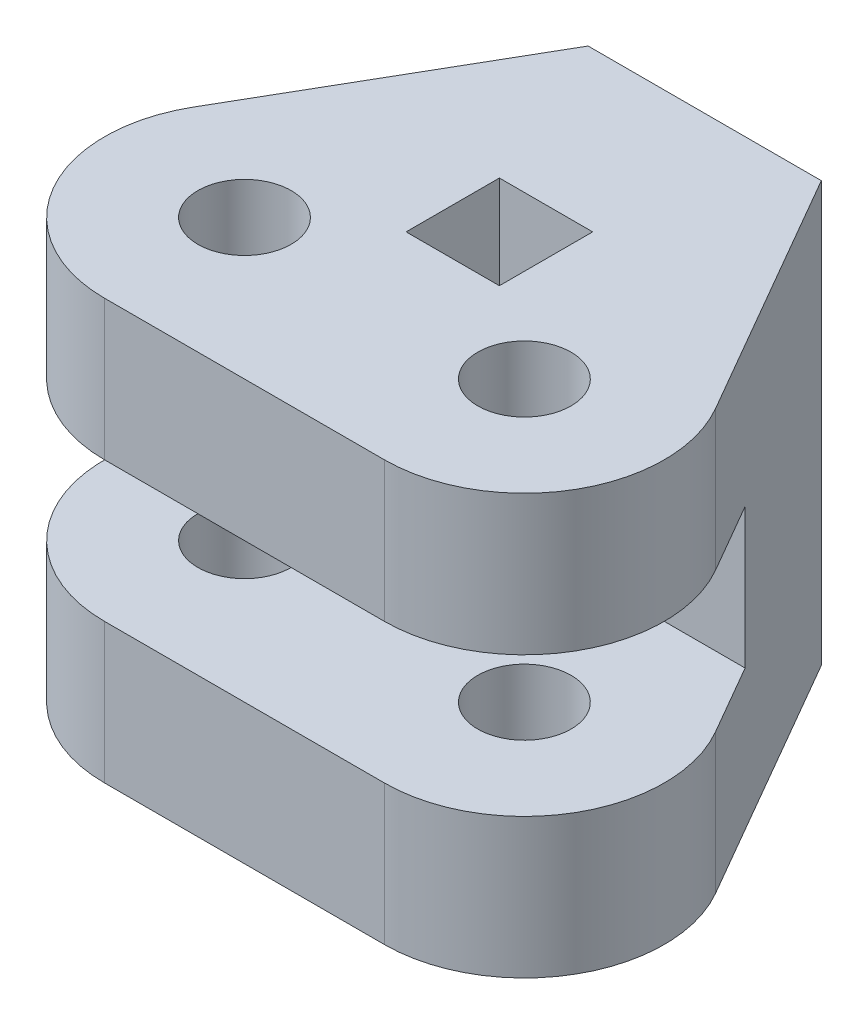
ISO-10303-21;
HEADER;
FILE_DESCRIPTION(('STEP AP214'),'2;1');
FILE_NAME('part.step','',(''),(''),'','','');
FILE_SCHEMA(('AUTOMOTIVE_DESIGN { 1 0 10303 214 1 1 1 1 }'));
ENDSEC;
DATA;
#1=APPLICATION_CONTEXT('core data for automotive mechanical design processes');
#2=APPLICATION_PROTOCOL_DEFINITION('international standard','automotive_design',2000,#1);
#3=PRODUCT_CONTEXT('',#1,'mechanical');
#4=PRODUCT('Part','Part','',(#3));
#5=PRODUCT_RELATED_PRODUCT_CATEGORY('part','',(#4));
#6=PRODUCT_DEFINITION_FORMATION('','',#4);
#7=PRODUCT_DEFINITION_CONTEXT('part definition',#1,'design');
#8=PRODUCT_DEFINITION('design','',#6,#7);
#9=PRODUCT_DEFINITION_SHAPE('','',#8);
#10=(LENGTH_UNIT() NAMED_UNIT(*) SI_UNIT(.MILLI.,.METRE.));
#11=(NAMED_UNIT(*) PLANE_ANGLE_UNIT() SI_UNIT($,.RADIAN.));
#12=(NAMED_UNIT(*) SI_UNIT($,.STERADIAN.) SOLID_ANGLE_UNIT());
#13=UNCERTAINTY_MEASURE_WITH_UNIT(LENGTH_MEASURE(1.E-05),#10,'distance_accuracy_value','');
#14=(GEOMETRIC_REPRESENTATION_CONTEXT(3) GLOBAL_UNCERTAINTY_ASSIGNED_CONTEXT((#13)) GLOBAL_UNIT_ASSIGNED_CONTEXT((#10,
#11,#12)) REPRESENTATION_CONTEXT('',''));
#15=CARTESIAN_POINT('',(0.,0.,0.));
#16=DIRECTION('',(0.,0.,1.));
#17=DIRECTION('',(1.,0.,0.));
#18=AXIS2_PLACEMENT_3D('',#15,#16,#17);
#19=CARTESIAN_POINT('',(3.,9.,5.19615242270663));
#20=DIRECTION('',(0.,-1.,0.));
#21=DIRECTION('',(0.,0.,-1.));
#22=AXIS2_PLACEMENT_3D('',#19,#20,#21);
#23=CYLINDRICAL_SURFACE('',#22,3.);
#24=DIRECTION('',(0.,-1.,0.));
#25=VECTOR('',#24,1.);
#26=CARTESIAN_POINT('',(2.99999999999996,9.,8.19615242270663));
#27=LINE('',#26,#25);
#28=CARTESIAN_POINT('',(2.99999999999996,9.,8.19615242270663));
#29=VERTEX_POINT('',#28);
#30=CARTESIAN_POINT('',(2.99999999999996,6.,8.19615242270663));
#31=VERTEX_POINT('',#30);
#32=EDGE_CURVE('E193',#29,#31,#27,.T.);
#33=ORIENTED_EDGE('',*,*,#32,.T.);
#34=CARTESIAN_POINT('',(3.,6.,5.19615242270663));
#35=DIRECTION('',(0.,1.,0.));
#36=DIRECTION('',(0.,0.,1.));
#37=AXIS2_PLACEMENT_3D('',#34,#35,#36);
#38=CIRCLE('',#37,3.);
#39=CARTESIAN_POINT('',(5.59807621135329,6.,3.69615242270659));
#40=VERTEX_POINT('',#39);
#41=EDGE_CURVE('E245',#31,#40,#38,.T.);
#42=ORIENTED_EDGE('',*,*,#41,.T.);
#43=DIRECTION('',(0.,-1.,0.));
#44=VECTOR('',#43,1.);
#45=CARTESIAN_POINT('',(5.59807621135329,9.,3.69615242270659));
#46=LINE('',#45,#44);
#47=CARTESIAN_POINT('',(5.59807621135329,9.,3.69615242270659));
#48=VERTEX_POINT('',#47);
#49=EDGE_CURVE('E43',#48,#40,#46,.T.);
#50=ORIENTED_EDGE('',*,*,#49,.F.);
#51=CARTESIAN_POINT('',(3.,9.,5.19615242270663));
#52=DIRECTION('',(0.,1.,0.));
#53=DIRECTION('',(0.,0.,-1.));
#54=AXIS2_PLACEMENT_3D('',#51,#52,#53);
#55=CIRCLE('',#54,3.);
#56=EDGE_CURVE('E301',#29,#48,#55,.T.);
#57=ORIENTED_EDGE('',*,*,#56,.F.);
#58=EDGE_LOOP('',(#33,#42,#50,#57));
#59=FACE_BOUND('',#58,.T.);
#60=ADVANCED_FACE('F35',(#59),#23,.T.);
#61=CARTESIAN_POINT('',(-3.,9.,5.19615242270663));
#62=DIRECTION('',(0.,-1.,0.));
#63=DIRECTION('',(0.,0.,-1.));
#64=AXIS2_PLACEMENT_3D('',#61,#62,#63);
#65=CYLINDRICAL_SURFACE('',#64,3.);
#66=DIRECTION('',(0.,-1.,0.));
#67=VECTOR('',#66,1.);
#68=CARTESIAN_POINT('',(-5.59807621135332,9.,3.69615242270663));
#69=LINE('',#68,#67);
#70=CARTESIAN_POINT('',(-5.59807621135332,9.,3.69615242270663));
#71=VERTEX_POINT('',#70);
#72=CARTESIAN_POINT('',(-5.59807621135332,6.,3.69615242270663));
#73=VERTEX_POINT('',#72);
#74=EDGE_CURVE('E207',#71,#73,#69,.T.);
#75=ORIENTED_EDGE('',*,*,#74,.T.);
#76=CARTESIAN_POINT('',(-3.,6.,5.19615242270663));
#77=DIRECTION('',(0.,1.,0.));
#78=DIRECTION('',(0.,0.,1.));
#79=AXIS2_PLACEMENT_3D('',#76,#77,#78);
#80=CIRCLE('',#79,3.);
#81=CARTESIAN_POINT('',(-3.,6.,8.19615242270663));
#82=VERTEX_POINT('',#81);
#83=EDGE_CURVE('E237',#73,#82,#80,.T.);
#84=ORIENTED_EDGE('',*,*,#83,.T.);
#85=DIRECTION('',(0.,-1.,0.));
#86=VECTOR('',#85,1.);
#87=CARTESIAN_POINT('',(-3.,9.,8.19615242270663));
#88=LINE('',#87,#86);
#89=CARTESIAN_POINT('',(-3.,9.,8.19615242270663));
#90=VERTEX_POINT('',#89);
#91=EDGE_CURVE('E203',#90,#82,#88,.T.);
#92=ORIENTED_EDGE('',*,*,#91,.F.);
#93=CARTESIAN_POINT('',(-3.,9.,5.19615242270663));
#94=DIRECTION('',(0.,1.,0.));
#95=DIRECTION('',(0.,0.,1.));
#96=AXIS2_PLACEMENT_3D('',#93,#94,#95);
#97=CIRCLE('',#96,3.);
#98=EDGE_CURVE('E198',#71,#90,#97,.T.);
#99=ORIENTED_EDGE('',*,*,#98,.F.);
#100=EDGE_LOOP('',(#75,#84,#92,#99));
#101=FACE_BOUND('',#100,.T.);
#102=ADVANCED_FACE('F423',(#101),#65,.T.);
#103=CARTESIAN_POINT('',(-3.,9.,8.19615242270663));
#104=DIRECTION('',(0.,0.,-1.));
#105=DIRECTION('',(-1.,0.,0.));
#106=AXIS2_PLACEMENT_3D('',#103,#104,#105);
#107=PLANE('',#106);
#108=ORIENTED_EDGE('',*,*,#91,.T.);
#109=DIRECTION('',(-1.,0.,0.));
#110=VECTOR('',#109,1.);
#111=CARTESIAN_POINT('',(-6.,6.,8.19615242270663));
#112=LINE('',#111,#110);
#113=EDGE_CURVE('E186',#31,#82,#112,.T.);
#114=ORIENTED_EDGE('',*,*,#113,.F.);
#115=ORIENTED_EDGE('',*,*,#32,.F.);
#116=DIRECTION('',(1.,0.,0.));
#117=VECTOR('',#116,1.);
#118=CARTESIAN_POINT('',(-3.,9.,8.19615242270663));
#119=LINE('',#118,#117);
#120=EDGE_CURVE('E194',#90,#29,#119,.T.);
#121=ORIENTED_EDGE('',*,*,#120,.F.);
#122=EDGE_LOOP('',(#108,#114,#115,#121));
#123=FACE_BOUND('',#122,.T.);
#124=ADVANCED_FACE('F421',(#123),#107,.F.);
#125=CARTESIAN_POINT('',(1.,9.,3.73205080756888));
#126=DIRECTION('',(0.,0.,-1.));
#127=DIRECTION('',(-1.,0.,0.));
#128=AXIS2_PLACEMENT_3D('',#125,#126,#127);
#129=PLANE('',#128);
#130=DIRECTION('',(1.,0.,0.));
#131=VECTOR('',#130,1.);
#132=CARTESIAN_POINT('',(1.,6.,3.73205080756888));
#133=LINE('',#132,#131);
#134=CARTESIAN_POINT('',(-1.,6.,3.73205080756888));
#135=VERTEX_POINT('',#134);
#136=CARTESIAN_POINT('',(1.,6.,3.73205080756888));
#137=VERTEX_POINT('',#136);
#138=EDGE_CURVE('E230',#135,#137,#133,.T.);
#139=ORIENTED_EDGE('',*,*,#138,.F.);
#140=DIRECTION('',(0.,-1.,0.));
#141=VECTOR('',#140,1.);
#142=CARTESIAN_POINT('',(-1.,9.,3.73205080756888));
#143=LINE('',#142,#141);
#144=CARTESIAN_POINT('',(-1.,9.,3.73205080756888));
#145=VERTEX_POINT('',#144);
#146=EDGE_CURVE('E297',#145,#135,#143,.T.);
#147=ORIENTED_EDGE('',*,*,#146,.F.);
#148=DIRECTION('',(1.,0.,0.));
#149=VECTOR('',#148,1.);
#150=CARTESIAN_POINT('',(1.,9.,3.73205080756888));
#151=LINE('',#150,#149);
#152=CARTESIAN_POINT('',(1.,9.,3.73205080756888));
#153=VERTEX_POINT('',#152);
#154=EDGE_CURVE('E269',#145,#153,#151,.T.);
#155=ORIENTED_EDGE('',*,*,#154,.T.);
#156=DIRECTION('',(0.,-1.,0.));
#157=VECTOR('',#156,1.);
#158=CARTESIAN_POINT('',(1.,9.,3.73205080756888));
#159=LINE('',#158,#157);
#160=EDGE_CURVE('E293',#153,#137,#159,.T.);
#161=ORIENTED_EDGE('',*,*,#160,.T.);
#162=EDGE_LOOP('',(#139,#147,#155,#161));
#163=FACE_BOUND('',#162,.T.);
#164=ADVANCED_FACE('F391',(#163),#129,.T.);
#165=CARTESIAN_POINT('',(-3.,9.,5.19615242270663));
#166=DIRECTION('',(0.,-1.,0.));
#167=DIRECTION('',(0.,0.,-1.));
#168=AXIS2_PLACEMENT_3D('',#165,#166,#167);
#169=CYLINDRICAL_SURFACE('',#168,1.);
#170=CARTESIAN_POINT('',(-3.,6.,5.19615242270663));
#171=DIRECTION('',(0.,1.,0.));
#172=DIRECTION('',(0.,0.,1.));
#173=AXIS2_PLACEMENT_3D('',#170,#171,#172);
#174=CIRCLE('',#173,1.);
#175=CARTESIAN_POINT('',(-3.,6.,6.19615242270664));
#176=VERTEX_POINT('',#175);
#177=EDGE_CURVE('E222',#176,#176,#174,.T.);
#178=ORIENTED_EDGE('',*,*,#177,.F.);
#179=EDGE_LOOP('',(#178));
#180=FACE_BOUND('',#179,.T.);
#181=CARTESIAN_POINT('',(-3.,9.,5.19615242270663));
#182=DIRECTION('',(0.,1.,0.));
#183=DIRECTION('',(0.,0.,1.));
#184=AXIS2_PLACEMENT_3D('',#181,#182,#183);
#185=CIRCLE('',#184,1.);
#186=CARTESIAN_POINT('',(-3.,9.,6.19615242270664));
#187=VERTEX_POINT('',#186);
#188=EDGE_CURVE('E261',#187,#187,#185,.T.);
#189=ORIENTED_EDGE('',*,*,#188,.T.);
#190=EDGE_LOOP('',(#189));
#191=FACE_BOUND('',#190,.T.);
#192=ADVANCED_FACE('F420',(#180,#191),#169,.F.);
#193=CARTESIAN_POINT('',(3.,9.,5.19615242270663));
#194=DIRECTION('',(0.,-1.,0.));
#195=DIRECTION('',(0.,0.,-1.));
#196=AXIS2_PLACEMENT_3D('',#193,#194,#195);
#197=CYLINDRICAL_SURFACE('',#196,1.);
#198=CARTESIAN_POINT('',(3.,6.,5.19615242270663));
#199=DIRECTION('',(0.,1.,0.));
#200=DIRECTION('',(0.,0.,1.));
#201=AXIS2_PLACEMENT_3D('',#198,#199,#200);
#202=CIRCLE('',#201,1.);
#203=CARTESIAN_POINT('',(3.,6.,6.19615242270663));
#204=VERTEX_POINT('',#203);
#205=EDGE_CURVE('E179',#204,#204,#202,.T.);
#206=ORIENTED_EDGE('',*,*,#205,.F.);
#207=EDGE_LOOP('',(#206));
#208=FACE_BOUND('',#207,.T.);
#209=CARTESIAN_POINT('',(3.,9.,5.19615242270663));
#210=DIRECTION('',(0.,1.,0.));
#211=DIRECTION('',(0.,0.,1.));
#212=AXIS2_PLACEMENT_3D('',#209,#210,#211);
#213=CIRCLE('',#212,1.);
#214=CARTESIAN_POINT('',(3.,9.,6.19615242270663));
#215=VERTEX_POINT('',#214);
#216=EDGE_CURVE('E255',#215,#215,#213,.T.);
#217=ORIENTED_EDGE('',*,*,#216,.T.);
#218=EDGE_LOOP('',(#217));
#219=FACE_BOUND('',#218,.T.);
#220=ADVANCED_FACE('F439',(#208,#219),#197,.F.);
#221=CARTESIAN_POINT('',(3.,9.,5.19615242270663));
#222=DIRECTION('',(0.,-1.,0.));
#223=DIRECTION('',(0.,0.,-1.));
#224=AXIS2_PLACEMENT_3D('',#221,#222,#223);
#225=PLANE('',#224);
#226=ORIENTED_EDGE('',*,*,#188,.F.);
#227=EDGE_LOOP('',(#226));
#228=FACE_BOUND('',#227,.T.);
#229=ORIENTED_EDGE('',*,*,#56,.T.);
#230=DIRECTION('',(-0.5,0.,-0.866025403784439));
#231=VECTOR('',#230,1.);
#232=CARTESIAN_POINT('',(5.59807621135329,9.,3.69615242270659));
#233=LINE('',#232,#231);
#234=CARTESIAN_POINT('',(2.5,9.,-1.66987298107781));
#235=VERTEX_POINT('',#234);
#236=EDGE_CURVE('E304',#48,#235,#233,.T.);
#237=ORIENTED_EDGE('',*,*,#236,.T.);
#238=DIRECTION('',(-1.,0.,0.));
#239=VECTOR('',#238,1.);
#240=CARTESIAN_POINT('',(-2.5,9.,-1.66987298107781));
#241=LINE('',#240,#239);
#242=CARTESIAN_POINT('',(-2.5,9.,-1.66987298107781));
#243=VERTEX_POINT('',#242);
#244=EDGE_CURVE('E306',#235,#243,#241,.T.);
#245=ORIENTED_EDGE('',*,*,#244,.T.);
#246=DIRECTION('',(-0.5,0.,0.866025403784439));
#247=VECTOR('',#246,1.);
#248=CARTESIAN_POINT('',(-2.5,9.,-1.66987298107781));
#249=LINE('',#248,#247);
#250=EDGE_CURVE('E308',#243,#71,#249,.T.);
#251=ORIENTED_EDGE('',*,*,#250,.T.);
#252=ORIENTED_EDGE('',*,*,#98,.T.);
#253=ORIENTED_EDGE('',*,*,#120,.T.);
#254=EDGE_LOOP('',(#229,#237,#245,#251,#252,#253));
#255=FACE_BOUND('',#254,.T.);
#256=DIRECTION('',(0.,0.,1.));
#257=VECTOR('',#256,1.);
#258=CARTESIAN_POINT('',(-1.,9.,3.73205080756888));
#259=LINE('',#258,#257);
#260=CARTESIAN_POINT('',(-1.,9.,1.73205080756888));
#261=VERTEX_POINT('',#260);
#262=EDGE_CURVE('E267',#261,#145,#259,.T.);
#263=ORIENTED_EDGE('',*,*,#262,.F.);
#264=DIRECTION('',(-1.,0.,0.));
#265=VECTOR('',#264,1.);
#266=CARTESIAN_POINT('',(-1.,9.,1.73205080756888));
#267=LINE('',#266,#265);
#268=CARTESIAN_POINT('',(1.,9.,1.73205080756888));
#269=VERTEX_POINT('',#268);
#270=EDGE_CURVE('E275',#269,#261,#267,.T.);
#271=ORIENTED_EDGE('',*,*,#270,.F.);
#272=DIRECTION('',(0.,0.,-1.));
#273=VECTOR('',#272,1.);
#274=CARTESIAN_POINT('',(1.,9.,1.73205080756888));
#275=LINE('',#274,#273);
#276=EDGE_CURVE('E272',#153,#269,#275,.T.);
#277=ORIENTED_EDGE('',*,*,#276,.F.);
#278=ORIENTED_EDGE('',*,*,#154,.F.);
#279=EDGE_LOOP('',(#263,#271,#277,#278));
#280=FACE_BOUND('',#279,.T.);
#281=ORIENTED_EDGE('',*,*,#216,.F.);
#282=EDGE_LOOP('',(#281));
#283=FACE_BOUND('',#282,.T.);
#284=ADVANCED_FACE('F339',(#228,#255,#280,#283),#225,.F.);
#285=CARTESIAN_POINT('',(3.,0.,5.19615242270663));
#286=DIRECTION('',(0.,-1.,0.));
#287=DIRECTION('',(0.,0.,-1.));
#288=AXIS2_PLACEMENT_3D('',#285,#286,#287);
#289=PLANE('',#288);
#290=CARTESIAN_POINT('',(-3.,0.,5.19615242270663));
#291=DIRECTION('',(0.,1.,0.));
#292=DIRECTION('',(0.,0.,1.));
#293=AXIS2_PLACEMENT_3D('',#290,#291,#292);
#294=CIRCLE('',#293,1.);
#295=CARTESIAN_POINT('',(-3.,0.,6.19615242270664));
#296=VERTEX_POINT('',#295);
#297=EDGE_CURVE('E258',#296,#296,#294,.T.);
#298=ORIENTED_EDGE('',*,*,#297,.T.);
#299=EDGE_LOOP('',(#298));
#300=FACE_BOUND('',#299,.T.);
#301=CARTESIAN_POINT('',(3.,0.,5.19615242270663));
#302=DIRECTION('',(0.,1.,0.));
#303=DIRECTION('',(0.,0.,-1.));
#304=AXIS2_PLACEMENT_3D('',#301,#302,#303);
#305=CIRCLE('',#304,3.);
#306=CARTESIAN_POINT('',(2.99999999999996,0.,8.19615242270663));
#307=VERTEX_POINT('',#306);
#308=CARTESIAN_POINT('',(5.59807621135329,0.,3.69615242270659));
#309=VERTEX_POINT('',#308);
#310=EDGE_CURVE('E300',#307,#309,#305,.T.);
#311=ORIENTED_EDGE('',*,*,#310,.F.);
#312=DIRECTION('',(1.,0.,0.));
#313=VECTOR('',#312,1.);
#314=CARTESIAN_POINT('',(-3.,0.,8.19615242270663));
#315=LINE('',#314,#313);
#316=CARTESIAN_POINT('',(-3.,0.,8.19615242270663));
#317=VERTEX_POINT('',#316);
#318=EDGE_CURVE('E191',#317,#307,#315,.T.);
#319=ORIENTED_EDGE('',*,*,#318,.F.);
#320=CARTESIAN_POINT('',(-3.,0.,5.19615242270663));
#321=DIRECTION('',(0.,1.,0.));
#322=DIRECTION('',(0.,0.,1.));
#323=AXIS2_PLACEMENT_3D('',#320,#321,#322);
#324=CIRCLE('',#323,3.);
#325=CARTESIAN_POINT('',(-5.59807621135332,0.,3.69615242270663));
#326=VERTEX_POINT('',#325);
#327=EDGE_CURVE('E318',#326,#317,#324,.T.);
#328=ORIENTED_EDGE('',*,*,#327,.F.);
#329=DIRECTION('',(-0.5,0.,0.866025403784439));
#330=VECTOR('',#329,1.);
#331=CARTESIAN_POINT('',(-2.5,0.,-1.66987298107781));
#332=LINE('',#331,#330);
#333=CARTESIAN_POINT('',(-2.5,0.,-1.66987298107781));
#334=VERTEX_POINT('',#333);
#335=EDGE_CURVE('E316',#334,#326,#332,.T.);
#336=ORIENTED_EDGE('',*,*,#335,.F.);
#337=DIRECTION('',(-1.,0.,0.));
#338=VECTOR('',#337,1.);
#339=CARTESIAN_POINT('',(-2.5,0.,-1.66987298107781));
#340=LINE('',#339,#338);
#341=CARTESIAN_POINT('',(2.5,0.,-1.66987298107781));
#342=VERTEX_POINT('',#341);
#343=EDGE_CURVE('E314',#342,#334,#340,.T.);
#344=ORIENTED_EDGE('',*,*,#343,.F.);
#345=DIRECTION('',(-0.5,0.,-0.866025403784439));
#346=VECTOR('',#345,1.);
#347=CARTESIAN_POINT('',(5.59807621135329,0.,3.69615242270659));
#348=LINE('',#347,#346);
#349=EDGE_CURVE('E312',#309,#342,#348,.T.);
#350=ORIENTED_EDGE('',*,*,#349,.F.);
#351=EDGE_LOOP('',(#311,#319,#328,#336,#344,#350));
#352=FACE_BOUND('',#351,.T.);
#353=DIRECTION('',(-1.,0.,0.));
#354=VECTOR('',#353,1.);
#355=CARTESIAN_POINT('',(-1.,0.,1.73205080756888));
#356=LINE('',#355,#354);
#357=CARTESIAN_POINT('',(1.,0.,1.73205080756888));
#358=VERTEX_POINT('',#357);
#359=CARTESIAN_POINT('',(-1.,0.,1.73205080756888));
#360=VERTEX_POINT('',#359);
#361=EDGE_CURVE('E270',#358,#360,#356,.T.);
#362=ORIENTED_EDGE('',*,*,#361,.T.);
#363=DIRECTION('',(0.,0.,1.));
#364=VECTOR('',#363,1.);
#365=CARTESIAN_POINT('',(-1.,0.,3.73205080756888));
#366=LINE('',#365,#364);
#367=CARTESIAN_POINT('',(-1.,0.,3.73205080756888));
#368=VERTEX_POINT('',#367);
#369=EDGE_CURVE('E264',#360,#368,#366,.T.);
#370=ORIENTED_EDGE('',*,*,#369,.T.);
#371=DIRECTION('',(1.,0.,0.));
#372=VECTOR('',#371,1.);
#373=CARTESIAN_POINT('',(1.,0.,3.73205080756888));
#374=LINE('',#373,#372);
#375=CARTESIAN_POINT('',(1.,0.,3.73205080756888));
#376=VERTEX_POINT('',#375);
#377=EDGE_CURVE('E280',#368,#376,#374,.T.);
#378=ORIENTED_EDGE('',*,*,#377,.T.);
#379=DIRECTION('',(0.,0.,-1.));
#380=VECTOR('',#379,1.);
#381=CARTESIAN_POINT('',(1.,0.,1.73205080756888));
#382=LINE('',#381,#380);
#383=EDGE_CURVE('E283',#376,#358,#382,.T.);
#384=ORIENTED_EDGE('',*,*,#383,.T.);
#385=EDGE_LOOP('',(#362,#370,#378,#384));
#386=FACE_BOUND('',#385,.T.);
#387=CARTESIAN_POINT('',(3.,0.,5.19615242270663));
#388=DIRECTION('',(0.,1.,0.));
#389=DIRECTION('',(0.,0.,1.));
#390=AXIS2_PLACEMENT_3D('',#387,#388,#389);
#391=CIRCLE('',#390,1.);
#392=CARTESIAN_POINT('',(3.,0.,6.19615242270663));
#393=VERTEX_POINT('',#392);
#394=EDGE_CURVE('E254',#393,#393,#391,.T.);
#395=ORIENTED_EDGE('',*,*,#394,.T.);
#396=EDGE_LOOP('',(#395));
#397=FACE_BOUND('',#396,.T.);
#398=ADVANCED_FACE('F326',(#300,#352,#386,#397),#289,.T.);
#399=CARTESIAN_POINT('',(5.59807621135329,3.,3.69615242270659));
#400=VERTEX_POINT('',#399);
#401=EDGE_CURVE('E177',#400,#309,#46,.T.);
#402=ORIENTED_EDGE('',*,*,#401,.F.);
#403=CARTESIAN_POINT('',(3.,3.,5.19615242270663));
#404=DIRECTION('',(0.,-1.,0.));
#405=DIRECTION('',(0.,0.,-1.));
#406=AXIS2_PLACEMENT_3D('',#403,#404,#405);
#407=CIRCLE('',#406,3.);
#408=CARTESIAN_POINT('',(2.99999999999996,3.,8.19615242270663));
#409=VERTEX_POINT('',#408);
#410=EDGE_CURVE('E172',#400,#409,#407,.T.);
#411=ORIENTED_EDGE('',*,*,#410,.T.);
#412=EDGE_CURVE('E175',#409,#307,#27,.T.);
#413=ORIENTED_EDGE('',*,*,#412,.T.);
#414=ORIENTED_EDGE('',*,*,#310,.T.);
#415=EDGE_LOOP('',(#402,#411,#413,#414));
#416=FACE_BOUND('',#415,.T.);
#417=ADVANCED_FACE('F37',(#416),#23,.T.);
#418=CARTESIAN_POINT('',(5.59807621135329,9.,3.69615242270659));
#419=DIRECTION('',(-0.866025403784439,0.,0.5));
#420=DIRECTION('',(0.5,0.,0.866025403784439));
#421=AXIS2_PLACEMENT_3D('',#418,#419,#420);
#422=PLANE('',#421);
#423=ORIENTED_EDGE('',*,*,#49,.T.);
#424=DIRECTION('',(-0.5,0.,-0.866025403784439));
#425=VECTOR('',#424,1.);
#426=CARTESIAN_POINT('',(5.59807621135329,6.,3.69615242270659));
#427=LINE('',#426,#425);
#428=CARTESIAN_POINT('',(4.73205080756888,6.,2.19615242270663));
#429=VERTEX_POINT('',#428);
#430=EDGE_CURVE('E242',#40,#429,#427,.T.);
#431=ORIENTED_EDGE('',*,*,#430,.T.);
#432=DIRECTION('',(0.,1.,0.));
#433=VECTOR('',#432,1.);
#434=CARTESIAN_POINT('',(4.73205080756888,9.,2.19615242270663));
#435=LINE('',#434,#433);
#436=CARTESIAN_POINT('',(4.73205080756888,3.,2.19615242270663));
#437=VERTEX_POINT('',#436);
#438=EDGE_CURVE('E252',#437,#429,#435,.T.);
#439=ORIENTED_EDGE('',*,*,#438,.F.);
#440=DIRECTION('',(0.5,0.,0.866025403784439));
#441=VECTOR('',#440,1.);
#442=CARTESIAN_POINT('',(5.59807621135329,3.,3.69615242270659));
#443=LINE('',#442,#441);
#444=EDGE_CURVE('E180',#437,#400,#443,.T.);
#445=ORIENTED_EDGE('',*,*,#444,.T.);
#446=ORIENTED_EDGE('',*,*,#401,.T.);
#447=ORIENTED_EDGE('',*,*,#349,.T.);
#448=DIRECTION('',(0.,-1.,0.));
#449=VECTOR('',#448,1.);
#450=CARTESIAN_POINT('',(2.5,9.,-1.66987298107781));
#451=LINE('',#450,#449);
#452=EDGE_CURVE('E213',#235,#342,#451,.T.);
#453=ORIENTED_EDGE('',*,*,#452,.F.);
#454=ORIENTED_EDGE('',*,*,#236,.F.);
#455=EDGE_LOOP('',(#423,#431,#439,#445,#446,#447,#453,#454));
#456=FACE_BOUND('',#455,.T.);
#457=ADVANCED_FACE('F332',(#456),#422,.F.);
#458=CARTESIAN_POINT('',(-2.5,9.,-1.66987298107781));
#459=DIRECTION('',(0.,0.,1.));
#460=DIRECTION('',(1.,0.,0.));
#461=AXIS2_PLACEMENT_3D('',#458,#459,#460);
#462=PLANE('',#461);
#463=CARTESIAN_POINT('',(0.,4.5,-1.66987298107781));
#464=DIRECTION('',(0.,0.,-1.));
#465=DIRECTION('',(-1.,0.,0.));
#466=AXIS2_PLACEMENT_3D('',#463,#464,#465);
#467=CIRCLE('',#466,0.5);
#468=CARTESIAN_POINT('',(-0.500000000000001,4.5,-1.66987298107781));
#469=VERTEX_POINT('',#468);
#470=EDGE_CURVE('E187',#469,#469,#467,.T.);
#471=ORIENTED_EDGE('',*,*,#470,.F.);
#472=EDGE_LOOP('',(#471));
#473=FACE_BOUND('',#472,.T.);
#474=ORIENTED_EDGE('',*,*,#343,.T.);
#475=DIRECTION('',(0.,-1.,0.));
#476=VECTOR('',#475,1.);
#477=CARTESIAN_POINT('',(-2.5,9.,-1.66987298107781));
#478=LINE('',#477,#476);
#479=EDGE_CURVE('E210',#243,#334,#478,.T.);
#480=ORIENTED_EDGE('',*,*,#479,.F.);
#481=ORIENTED_EDGE('',*,*,#244,.F.);
#482=ORIENTED_EDGE('',*,*,#452,.T.);
#483=EDGE_LOOP('',(#474,#480,#481,#482));
#484=FACE_BOUND('',#483,.T.);
#485=ADVANCED_FACE('F335',(#473,#484),#462,.F.);
#486=CARTESIAN_POINT('',(-2.5,9.,-1.66987298107781));
#487=DIRECTION('',(0.866025403784439,0.,0.5));
#488=DIRECTION('',(0.5,0.,-0.866025403784439));
#489=AXIS2_PLACEMENT_3D('',#486,#487,#488);
#490=PLANE('',#489);
#491=DIRECTION('',(0.,-1.,0.));
#492=VECTOR('',#491,1.);
#493=CARTESIAN_POINT('',(-4.73205080756888,9.,2.19615242270663));
#494=LINE('',#493,#492);
#495=CARTESIAN_POINT('',(-4.73205080756888,6.,2.19615242270663));
#496=VERTEX_POINT('',#495);
#497=CARTESIAN_POINT('',(-4.73205080756888,3.,2.19615242270663));
#498=VERTEX_POINT('',#497);
#499=EDGE_CURVE('E250',#496,#498,#494,.T.);
#500=ORIENTED_EDGE('',*,*,#499,.F.);
#501=DIRECTION('',(-0.5,0.,0.866025403784439));
#502=VECTOR('',#501,1.);
#503=CARTESIAN_POINT('',(-2.5,6.,-1.66987298107781));
#504=LINE('',#503,#502);
#505=EDGE_CURVE('E239',#496,#73,#504,.T.);
#506=ORIENTED_EDGE('',*,*,#505,.T.);
#507=ORIENTED_EDGE('',*,*,#74,.F.);
#508=ORIENTED_EDGE('',*,*,#250,.F.);
#509=ORIENTED_EDGE('',*,*,#479,.T.);
#510=ORIENTED_EDGE('',*,*,#335,.T.);
#511=CARTESIAN_POINT('',(-5.59807621135332,3.,3.69615242270663));
#512=VERTEX_POINT('',#511);
#513=EDGE_CURVE('E206',#512,#326,#69,.T.);
#514=ORIENTED_EDGE('',*,*,#513,.F.);
#515=DIRECTION('',(0.5,0.,-0.866025403784439));
#516=VECTOR('',#515,1.);
#517=CARTESIAN_POINT('',(-2.5,3.,-1.66987298107781));
#518=LINE('',#517,#516);
#519=EDGE_CURVE('E371',#512,#498,#518,.T.);
#520=ORIENTED_EDGE('',*,*,#519,.T.);
#521=EDGE_LOOP('',(#500,#506,#507,#508,#509,#510,#514,#520));
#522=FACE_BOUND('',#521,.T.);
#523=ADVANCED_FACE('F446',(#522),#490,.F.);
#524=CARTESIAN_POINT('',(-3.,3.,8.19615242270663));
#525=VERTEX_POINT('',#524);
#526=EDGE_CURVE('E197',#525,#317,#88,.T.);
#527=ORIENTED_EDGE('',*,*,#526,.F.);
#528=CARTESIAN_POINT('',(-3.,3.,5.19615242270663));
#529=DIRECTION('',(0.,-1.,0.));
#530=DIRECTION('',(0.,0.,-1.));
#531=AXIS2_PLACEMENT_3D('',#528,#529,#530);
#532=CIRCLE('',#531,3.);
#533=EDGE_CURVE('E50',#525,#512,#532,.T.);
#534=ORIENTED_EDGE('',*,*,#533,.T.);
#535=ORIENTED_EDGE('',*,*,#513,.T.);
#536=ORIENTED_EDGE('',*,*,#327,.T.);
#537=EDGE_LOOP('',(#527,#534,#535,#536));
#538=FACE_BOUND('',#537,.T.);
#539=ADVANCED_FACE('F322',(#538),#65,.T.);
#540=ORIENTED_EDGE('',*,*,#412,.F.);
#541=DIRECTION('',(1.,0.,0.));
#542=VECTOR('',#541,1.);
#543=CARTESIAN_POINT('',(-6.,3.,8.19615242270663));
#544=LINE('',#543,#542);
#545=EDGE_CURVE('E182',#525,#409,#544,.T.);
#546=ORIENTED_EDGE('',*,*,#545,.F.);
#547=ORIENTED_EDGE('',*,*,#526,.T.);
#548=ORIENTED_EDGE('',*,*,#318,.T.);
#549=EDGE_LOOP('',(#540,#546,#547,#548));
#550=FACE_BOUND('',#549,.T.);
#551=ADVANCED_FACE('F189',(#550),#107,.F.);
#552=CARTESIAN_POINT('',(-1.,9.,3.73205080756888));
#553=DIRECTION('',(1.,0.,0.));
#554=DIRECTION('',(0.,0.,-1.));
#555=AXIS2_PLACEMENT_3D('',#552,#553,#554);
#556=PLANE('',#555);
#557=DIRECTION('',(0.,0.,1.));
#558=VECTOR('',#557,1.);
#559=CARTESIAN_POINT('',(-1.,6.,3.73205080756888));
#560=LINE('',#559,#558);
#561=CARTESIAN_POINT('',(-1.,6.,2.19615242270663));
#562=VERTEX_POINT('',#561);
#563=EDGE_CURVE('E235',#562,#135,#560,.T.);
#564=ORIENTED_EDGE('',*,*,#563,.F.);
#565=DIRECTION('',(0.,-1.,0.));
#566=VECTOR('',#565,1.);
#567=CARTESIAN_POINT('',(-1.,9.,2.19615242270663));
#568=LINE('',#567,#566);
#569=CARTESIAN_POINT('',(-1.,3.,2.19615242270663));
#570=VERTEX_POINT('',#569);
#571=EDGE_CURVE('E247',#562,#570,#568,.T.);
#572=ORIENTED_EDGE('',*,*,#571,.T.);
#573=DIRECTION('',(0.,0.,-1.));
#574=VECTOR('',#573,1.);
#575=CARTESIAN_POINT('',(-1.,3.,3.73205080756888));
#576=LINE('',#575,#574);
#577=CARTESIAN_POINT('',(-1.,3.,3.73205080756888));
#578=VERTEX_POINT('',#577);
#579=EDGE_CURVE('E368',#578,#570,#576,.T.);
#580=ORIENTED_EDGE('',*,*,#579,.F.);
#581=EDGE_CURVE('E296',#578,#368,#143,.T.);
#582=ORIENTED_EDGE('',*,*,#581,.T.);
#583=ORIENTED_EDGE('',*,*,#369,.F.);
#584=DIRECTION('',(0.,-1.,0.));
#585=VECTOR('',#584,1.);
#586=CARTESIAN_POINT('',(-1.,9.,1.73205080756888));
#587=LINE('',#586,#585);
#588=EDGE_CURVE('E277',#261,#360,#587,.T.);
#589=ORIENTED_EDGE('',*,*,#588,.F.);
#590=ORIENTED_EDGE('',*,*,#262,.T.);
#591=ORIENTED_EDGE('',*,*,#146,.T.);
#592=EDGE_LOOP('',(#564,#572,#580,#582,#583,#589,#590,#591));
#593=FACE_BOUND('',#592,.T.);
#594=ADVANCED_FACE('F386',(#593),#556,.T.);
#595=DIRECTION('',(-1.,0.,0.));
#596=VECTOR('',#595,1.);
#597=CARTESIAN_POINT('',(1.,3.,3.73205080756888));
#598=LINE('',#597,#596);
#599=CARTESIAN_POINT('',(1.,3.,3.73205080756888));
#600=VERTEX_POINT('',#599);
#601=EDGE_CURVE('E366',#600,#578,#598,.T.);
#602=ORIENTED_EDGE('',*,*,#601,.F.);
#603=EDGE_CURVE('E292',#600,#376,#159,.T.);
#604=ORIENTED_EDGE('',*,*,#603,.T.);
#605=ORIENTED_EDGE('',*,*,#377,.F.);
#606=ORIENTED_EDGE('',*,*,#581,.F.);
#607=EDGE_LOOP('',(#602,#604,#605,#606));
#608=FACE_BOUND('',#607,.T.);
#609=ADVANCED_FACE('F410',(#608),#129,.T.);
#610=CARTESIAN_POINT('',(1.,9.,1.73205080756888));
#611=DIRECTION('',(-1.,0.,0.));
#612=DIRECTION('',(0.,0.,1.));
#613=AXIS2_PLACEMENT_3D('',#610,#611,#612);
#614=PLANE('',#613);
#615=DIRECTION('',(0.,0.,-1.));
#616=VECTOR('',#615,1.);
#617=CARTESIAN_POINT('',(1.,6.,1.73205080756888));
#618=LINE('',#617,#616);
#619=CARTESIAN_POINT('',(1.,6.,2.19615242270663));
#620=VERTEX_POINT('',#619);
#621=EDGE_CURVE('E226',#137,#620,#618,.T.);
#622=ORIENTED_EDGE('',*,*,#621,.F.);
#623=ORIENTED_EDGE('',*,*,#160,.F.);
#624=ORIENTED_EDGE('',*,*,#276,.T.);
#625=DIRECTION('',(0.,-1.,0.));
#626=VECTOR('',#625,1.);
#627=CARTESIAN_POINT('',(1.,9.,1.73205080756888));
#628=LINE('',#627,#626);
#629=EDGE_CURVE('E290',#269,#358,#628,.T.);
#630=ORIENTED_EDGE('',*,*,#629,.T.);
#631=ORIENTED_EDGE('',*,*,#383,.F.);
#632=ORIENTED_EDGE('',*,*,#603,.F.);
#633=DIRECTION('',(0.,0.,1.));
#634=VECTOR('',#633,1.);
#635=CARTESIAN_POINT('',(1.,3.,1.73205080756888));
#636=LINE('',#635,#634);
#637=CARTESIAN_POINT('',(1.,3.,2.19615242270663));
#638=VERTEX_POINT('',#637);
#639=EDGE_CURVE('E364',#638,#600,#636,.T.);
#640=ORIENTED_EDGE('',*,*,#639,.F.);
#641=DIRECTION('',(0.,1.,0.));
#642=VECTOR('',#641,1.);
#643=CARTESIAN_POINT('',(1.,9.,2.19615242270663));
#644=LINE('',#643,#642);
#645=EDGE_CURVE('E11',#638,#620,#644,.T.);
#646=ORIENTED_EDGE('',*,*,#645,.T.);
#647=EDGE_LOOP('',(#622,#623,#624,#630,#631,#632,#640,#646));
#648=FACE_BOUND('',#647,.T.);
#649=ADVANCED_FACE('F396',(#648),#614,.T.);
#650=CARTESIAN_POINT('',(-1.,9.,1.73205080756888));
#651=DIRECTION('',(0.,0.,1.));
#652=DIRECTION('',(1.,0.,0.));
#653=AXIS2_PLACEMENT_3D('',#650,#651,#652);
#654=PLANE('',#653);
#655=CARTESIAN_POINT('',(0.,4.5,1.73205080756888));
#656=DIRECTION('',(0.,0.,1.));
#657=DIRECTION('',(1.,0.,0.));
#658=AXIS2_PLACEMENT_3D('',#655,#656,#657);
#659=CIRCLE('',#658,0.5);
#660=CARTESIAN_POINT('',(0.5,4.5,1.73205080756888));
#661=VERTEX_POINT('',#660);
#662=EDGE_CURVE('E457',#661,#661,#659,.F.);
#663=ORIENTED_EDGE('',*,*,#662,.T.);
#664=EDGE_LOOP('',(#663));
#665=FACE_BOUND('',#664,.T.);
#666=ORIENTED_EDGE('',*,*,#361,.F.);
#667=ORIENTED_EDGE('',*,*,#629,.F.);
#668=ORIENTED_EDGE('',*,*,#270,.T.);
#669=ORIENTED_EDGE('',*,*,#588,.T.);
#670=EDGE_LOOP('',(#666,#667,#668,#669));
#671=FACE_BOUND('',#670,.T.);
#672=ADVANCED_FACE('F403',(#665,#671),#654,.T.);
#673=CARTESIAN_POINT('',(-3.,3.,5.19615242270663));
#674=DIRECTION('',(0.,-1.,0.));
#675=DIRECTION('',(0.,0.,-1.));
#676=AXIS2_PLACEMENT_3D('',#673,#674,#675);
#677=CIRCLE('',#676,1.);
#678=CARTESIAN_POINT('',(-3.,3.,4.19615242270663));
#679=VERTEX_POINT('',#678);
#680=EDGE_CURVE('E220',#679,#679,#677,.T.);
#681=ORIENTED_EDGE('',*,*,#680,.F.);
#682=EDGE_LOOP('',(#681));
#683=FACE_BOUND('',#682,.T.);
#684=ORIENTED_EDGE('',*,*,#297,.F.);
#685=EDGE_LOOP('',(#684));
#686=FACE_BOUND('',#685,.T.);
#687=ADVANCED_FACE('F479',(#683,#686),#169,.F.);
#688=CARTESIAN_POINT('',(3.,3.,5.19615242270663));
#689=DIRECTION('',(0.,-1.,0.));
#690=DIRECTION('',(0.,0.,-1.));
#691=AXIS2_PLACEMENT_3D('',#688,#689,#690);
#692=CIRCLE('',#691,1.);
#693=CARTESIAN_POINT('',(3.,3.,4.19615242270663));
#694=VERTEX_POINT('',#693);
#695=EDGE_CURVE('E218',#694,#694,#692,.T.);
#696=ORIENTED_EDGE('',*,*,#695,.F.);
#697=EDGE_LOOP('',(#696));
#698=FACE_BOUND('',#697,.T.);
#699=ORIENTED_EDGE('',*,*,#394,.F.);
#700=EDGE_LOOP('',(#699));
#701=FACE_BOUND('',#700,.T.);
#702=ADVANCED_FACE('F474',(#698,#701),#197,.F.);
#703=CARTESIAN_POINT('',(-6.,3.,2.19615242270663));
#704=DIRECTION('',(0.,0.,1.));
#705=DIRECTION('',(1.,0.,0.));
#706=AXIS2_PLACEMENT_3D('',#703,#704,#705);
#707=PLANE('',#706);
#708=ORIENTED_EDGE('',*,*,#438,.T.);
#709=DIRECTION('',(-1.,0.,0.));
#710=VECTOR('',#709,1.);
#711=CARTESIAN_POINT('',(-6.,6.,2.19615242270663));
#712=LINE('',#711,#710);
#713=EDGE_CURVE('E58',#429,#620,#712,.T.);
#714=ORIENTED_EDGE('',*,*,#713,.T.);
#715=ORIENTED_EDGE('',*,*,#645,.F.);
#716=DIRECTION('',(1.,0.,0.));
#717=VECTOR('',#716,1.);
#718=CARTESIAN_POINT('',(-6.,3.,2.19615242270663));
#719=LINE('',#718,#717);
#720=EDGE_CURVE('E358',#638,#437,#719,.T.);
#721=ORIENTED_EDGE('',*,*,#720,.T.);
#722=EDGE_LOOP('',(#708,#714,#715,#721));
#723=FACE_BOUND('',#722,.T.);
#724=ADVANCED_FACE('F376',(#723),#707,.T.);
#725=ORIENTED_EDGE('',*,*,#499,.T.);
#726=EDGE_CURVE('E356',#498,#570,#719,.T.);
#727=ORIENTED_EDGE('',*,*,#726,.T.);
#728=ORIENTED_EDGE('',*,*,#571,.F.);
#729=EDGE_CURVE('E353',#562,#496,#712,.T.);
#730=ORIENTED_EDGE('',*,*,#729,.T.);
#731=EDGE_LOOP('',(#725,#727,#728,#730));
#732=FACE_BOUND('',#731,.T.);
#733=ADVANCED_FACE('F380',(#732),#707,.T.);
#734=CARTESIAN_POINT('',(-6.,6.,2.19615242270663));
#735=DIRECTION('',(0.,1.,0.));
#736=DIRECTION('',(0.,0.,1.));
#737=AXIS2_PLACEMENT_3D('',#734,#735,#736);
#738=PLANE('',#737);
#739=ORIENTED_EDGE('',*,*,#177,.T.);
#740=EDGE_LOOP('',(#739));
#741=FACE_BOUND('',#740,.T.);
#742=ORIENTED_EDGE('',*,*,#205,.T.);
#743=EDGE_LOOP('',(#742));
#744=FACE_BOUND('',#743,.T.);
#745=ORIENTED_EDGE('',*,*,#113,.T.);
#746=ORIENTED_EDGE('',*,*,#83,.F.);
#747=ORIENTED_EDGE('',*,*,#505,.F.);
#748=ORIENTED_EDGE('',*,*,#729,.F.);
#749=ORIENTED_EDGE('',*,*,#563,.T.);
#750=ORIENTED_EDGE('',*,*,#138,.T.);
#751=ORIENTED_EDGE('',*,*,#621,.T.);
#752=ORIENTED_EDGE('',*,*,#713,.F.);
#753=ORIENTED_EDGE('',*,*,#430,.F.);
#754=ORIENTED_EDGE('',*,*,#41,.F.);
#755=EDGE_LOOP('',(#745,#746,#747,#748,#749,#750,#751,#752,#753,#754));
#756=FACE_BOUND('',#755,.T.);
#757=ADVANCED_FACE('F351',(#741,#744,#756),#738,.F.);
#758=CARTESIAN_POINT('',(-6.,3.,2.19615242270663));
#759=DIRECTION('',(0.,-1.,0.));
#760=DIRECTION('',(0.,0.,-1.));
#761=AXIS2_PLACEMENT_3D('',#758,#759,#760);
#762=PLANE('',#761);
#763=ORIENTED_EDGE('',*,*,#680,.T.);
#764=EDGE_LOOP('',(#763));
#765=FACE_BOUND('',#764,.T.);
#766=ORIENTED_EDGE('',*,*,#695,.T.);
#767=EDGE_LOOP('',(#766));
#768=FACE_BOUND('',#767,.T.);
#769=ORIENTED_EDGE('',*,*,#410,.F.);
#770=ORIENTED_EDGE('',*,*,#444,.F.);
#771=ORIENTED_EDGE('',*,*,#720,.F.);
#772=ORIENTED_EDGE('',*,*,#639,.T.);
#773=ORIENTED_EDGE('',*,*,#601,.T.);
#774=ORIENTED_EDGE('',*,*,#579,.T.);
#775=ORIENTED_EDGE('',*,*,#726,.F.);
#776=ORIENTED_EDGE('',*,*,#519,.F.);
#777=ORIENTED_EDGE('',*,*,#533,.F.);
#778=ORIENTED_EDGE('',*,*,#545,.T.);
#779=EDGE_LOOP('',(#769,#770,#771,#772,#773,#774,#775,#776,#777,#778));
#780=FACE_BOUND('',#779,.T.);
#781=ADVANCED_FACE('F183',(#765,#768,#780),#762,.F.);
#782=CARTESIAN_POINT('',(0.,4.5,8.19715242270663));
#783=DIRECTION('',(0.,0.,-1.));
#784=DIRECTION('',(-1.,0.,0.));
#785=AXIS2_PLACEMENT_3D('',#782,#783,#784);
#786=CYLINDRICAL_SURFACE('',#785,0.5);
#787=ORIENTED_EDGE('',*,*,#662,.F.);
#788=EDGE_LOOP('',(#787));
#789=FACE_BOUND('',#788,.T.);
#790=ORIENTED_EDGE('',*,*,#470,.T.);
#791=EDGE_LOOP('',(#790));
#792=FACE_BOUND('',#791,.T.);
#793=ADVANCED_FACE('F463',(#789,#792),#786,.F.);
#794=CLOSED_SHELL('',(#60,#102,#124,#164,#192,#220,#284,#398,#417,#457,#485,#523,#539,#551,#594,
#609,#649,#672,#687,#702,#724,#733,#757,#781,#793));
#795=MANIFOLD_SOLID_BREP('B2',#794);
#796=ADVANCED_BREP_SHAPE_REPRESENTATION('',(#18,#795),#14);
#797=SHAPE_DEFINITION_REPRESENTATION(#9,#796);
ENDSEC;
END-ISO-10303-21;
